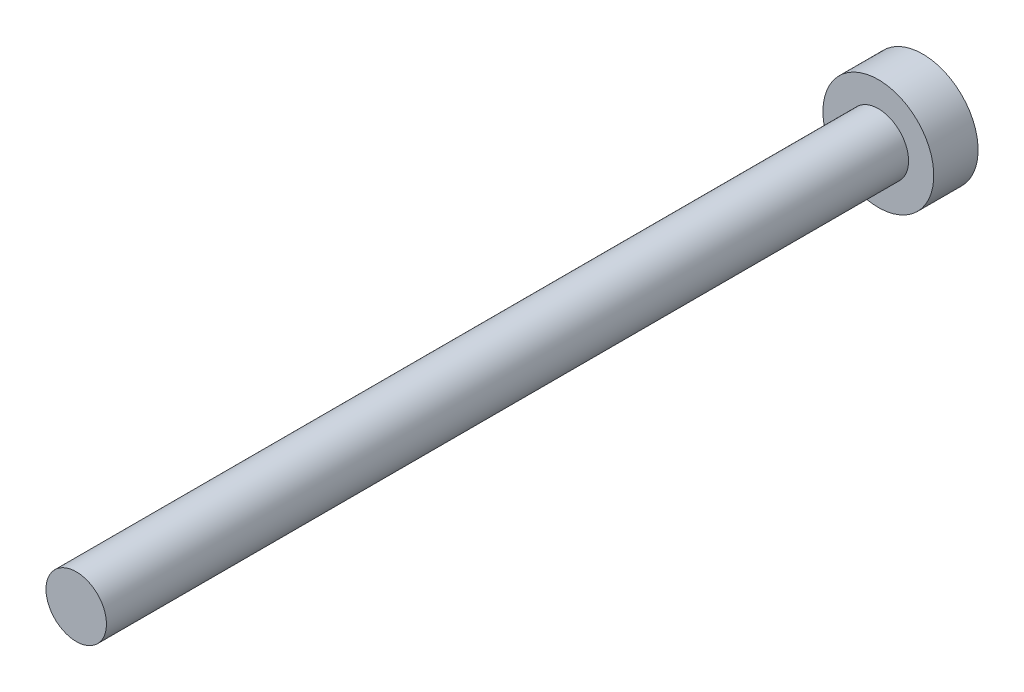
ISO-10303-21;
HEADER;
FILE_DESCRIPTION(('STEP AP214'),'2;1');
FILE_NAME('part.step','',(''),(''),'','','');
FILE_SCHEMA(('AUTOMOTIVE_DESIGN { 1 0 10303 214 1 1 1 1 }'));
ENDSEC;
DATA;
#1=APPLICATION_CONTEXT('core data for automotive mechanical design processes');
#2=APPLICATION_PROTOCOL_DEFINITION('international standard','automotive_design',2000,#1);
#3=PRODUCT_CONTEXT('',#1,'mechanical');
#4=PRODUCT('Part','Part','',(#3));
#5=PRODUCT_RELATED_PRODUCT_CATEGORY('part','',(#4));
#6=PRODUCT_DEFINITION_FORMATION('','',#4);
#7=PRODUCT_DEFINITION_CONTEXT('part definition',#1,'design');
#8=PRODUCT_DEFINITION('design','',#6,#7);
#9=PRODUCT_DEFINITION_SHAPE('','',#8);
#10=(LENGTH_UNIT() NAMED_UNIT(*) SI_UNIT(.MILLI.,.METRE.));
#11=(NAMED_UNIT(*) PLANE_ANGLE_UNIT() SI_UNIT($,.RADIAN.));
#12=(NAMED_UNIT(*) SI_UNIT($,.STERADIAN.) SOLID_ANGLE_UNIT());
#13=UNCERTAINTY_MEASURE_WITH_UNIT(LENGTH_MEASURE(1.E-05),#10,'distance_accuracy_value','');
#14=(GEOMETRIC_REPRESENTATION_CONTEXT(3) GLOBAL_UNCERTAINTY_ASSIGNED_CONTEXT((#13)) GLOBAL_UNIT_ASSIGNED_CONTEXT((#10,
#11,#12)) REPRESENTATION_CONTEXT('',''));
#15=CARTESIAN_POINT('',(0.,0.,0.));
#16=DIRECTION('',(0.,0.,1.));
#17=DIRECTION('',(1.,0.,0.));
#18=AXIS2_PLACEMENT_3D('',#15,#16,#17);
#19=CARTESIAN_POINT('',(0.,0.,42.));
#20=DIRECTION('',(0.,0.,-1.));
#21=DIRECTION('',(-1.,0.,0.));
#22=AXIS2_PLACEMENT_3D('',#19,#20,#21);
#23=CYLINDRICAL_SURFACE('',#22,1.5);
#24=CARTESIAN_POINT('',(0.,0.,42.));
#25=DIRECTION('',(0.,0.,1.));
#26=DIRECTION('',(1.,0.,0.));
#27=AXIS2_PLACEMENT_3D('',#24,#25,#26);
#28=CIRCLE('',#27,1.5);
#29=CARTESIAN_POINT('',(-1.5,0.,42.));
#30=VERTEX_POINT('',#29);
#31=EDGE_CURVE('E41',#30,#30,#28,.T.);
#32=CARTESIAN_POINT('',(0.,0.,2.2));
#33=DIRECTION('',(0.,0.,-1.));
#34=DIRECTION('',(-1.,0.,0.));
#35=AXIS2_PLACEMENT_3D('',#32,#33,#34);
#36=CIRCLE('',#35,1.5);
#37=CARTESIAN_POINT('',(-1.5,0.,2.20000000000001));
#38=VERTEX_POINT('',#37);
#39=EDGE_CURVE('E10',#38,#38,#36,.T.);
#40=CARTESIAN_POINT('',(-1.5,0.,42.));
#41=CARTESIAN_POINT('',(-1.5,0.,41.5854166666667));
#42=CARTESIAN_POINT('',(-1.5,0.,41.1708333333333));
#43=CARTESIAN_POINT('',(-1.5,0.,40.3416666666667));
#44=CARTESIAN_POINT('',(-1.5,0.,39.9270833333333));
#45=CARTESIAN_POINT('',(-1.5,0.,39.0979166666667));
#46=CARTESIAN_POINT('',(-1.5,0.,38.6833333333333));
#47=CARTESIAN_POINT('',(-1.5,0.,37.8541666666667));
#48=CARTESIAN_POINT('',(-1.5,0.,37.4395833333333));
#49=CARTESIAN_POINT('',(-1.5,0.,36.6104166666667));
#50=CARTESIAN_POINT('',(-1.5,0.,36.1958333333333));
#51=CARTESIAN_POINT('',(-1.5,0.,35.3666666666667));
#52=CARTESIAN_POINT('',(-1.5,0.,34.9520833333333));
#53=CARTESIAN_POINT('',(-1.5,0.,34.1229166666667));
#54=CARTESIAN_POINT('',(-1.5,0.,33.7083333333333));
#55=CARTESIAN_POINT('',(-1.5,0.,32.8791666666667));
#56=CARTESIAN_POINT('',(-1.5,0.,32.4645833333333));
#57=CARTESIAN_POINT('',(-1.5,0.,31.6354166666667));
#58=CARTESIAN_POINT('',(-1.5,0.,31.2208333333333));
#59=CARTESIAN_POINT('',(-1.5,0.,30.3916666666667));
#60=CARTESIAN_POINT('',(-1.5,0.,29.9770833333333));
#61=CARTESIAN_POINT('',(-1.5,0.,29.1479166666667));
#62=CARTESIAN_POINT('',(-1.5,0.,28.7333333333333));
#63=CARTESIAN_POINT('',(-1.5,0.,27.9041666666667));
#64=CARTESIAN_POINT('',(-1.5,0.,27.4895833333333));
#65=CARTESIAN_POINT('',(-1.5,0.,26.6604166666667));
#66=CARTESIAN_POINT('',(-1.5,0.,26.2458333333333));
#67=CARTESIAN_POINT('',(-1.5,0.,25.4166666666667));
#68=CARTESIAN_POINT('',(-1.5,0.,25.0020833333333));
#69=CARTESIAN_POINT('',(-1.5,0.,24.1729166666667));
#70=CARTESIAN_POINT('',(-1.5,0.,23.7583333333333));
#71=CARTESIAN_POINT('',(-1.5,0.,22.9291666666667));
#72=CARTESIAN_POINT('',(-1.5,0.,22.5145833333333));
#73=CARTESIAN_POINT('',(-1.5,0.,21.6854166666667));
#74=CARTESIAN_POINT('',(-1.5,0.,21.2708333333333));
#75=CARTESIAN_POINT('',(-1.5,0.,20.4416666666667));
#76=CARTESIAN_POINT('',(-1.5,0.,20.0270833333333));
#77=CARTESIAN_POINT('',(-1.5,0.,19.1979166666667));
#78=CARTESIAN_POINT('',(-1.5,0.,18.7833333333333));
#79=CARTESIAN_POINT('',(-1.5,0.,17.9541666666667));
#80=CARTESIAN_POINT('',(-1.5,0.,17.5395833333333));
#81=CARTESIAN_POINT('',(-1.5,0.,16.7104166666667));
#82=CARTESIAN_POINT('',(-1.5,0.,16.2958333333333));
#83=CARTESIAN_POINT('',(-1.5,0.,15.4666666666667));
#84=CARTESIAN_POINT('',(-1.5,0.,15.0520833333333));
#85=CARTESIAN_POINT('',(-1.5,0.,14.2229166666667));
#86=CARTESIAN_POINT('',(-1.5,0.,13.8083333333333));
#87=CARTESIAN_POINT('',(-1.5,0.,12.9791666666667));
#88=CARTESIAN_POINT('',(-1.5,0.,12.5645833333333));
#89=CARTESIAN_POINT('',(-1.5,0.,11.7354166666667));
#90=CARTESIAN_POINT('',(-1.5,0.,11.3208333333333));
#91=CARTESIAN_POINT('',(-1.5,0.,10.4916666666667));
#92=CARTESIAN_POINT('',(-1.5,0.,10.0770833333333));
#93=CARTESIAN_POINT('',(-1.5,0.,9.24791666666667));
#94=CARTESIAN_POINT('',(-1.5,0.,8.83333333333334));
#95=CARTESIAN_POINT('',(-1.5,0.,8.00416666666668));
#96=CARTESIAN_POINT('',(-1.5,0.,7.58958333333334));
#97=CARTESIAN_POINT('',(-1.5,0.,6.76041666666667));
#98=CARTESIAN_POINT('',(-1.5,0.,6.34583333333334));
#99=CARTESIAN_POINT('',(-1.5,0.,5.51666666666667));
#100=CARTESIAN_POINT('',(-1.5,0.,5.10208333333334));
#101=CARTESIAN_POINT('',(-1.5,0.,4.27291666666668));
#102=CARTESIAN_POINT('',(-1.5,0.,3.85833333333334));
#103=CARTESIAN_POINT('',(-1.5,0.,3.02916666666668));
#104=CARTESIAN_POINT('',(-1.5,0.,2.61458333333334));
#105=CARTESIAN_POINT('',(-1.5,0.,2.20000000000001));
#106=B_SPLINE_CURVE_WITH_KNOTS('',3,(#40,#41,#42,#43,#44,#45,#46,#47,#48,#49,#50,#51,#52,#53,
#54,#55,#56,#57,#58,#59,#60,#61,#62,#63,#64,#65,#66,#67,#68,#69,#70,#71,#72,#73,#74,#75,#76,#77,
#78,#79,#80,#81,#82,#83,#84,#85,#86,#87,#88,#89,#90,#91,#92,#93,#94,#95,#96,#97,#98,#99,#100,
#101,#102,#103,#104,#105),.UNSPECIFIED.,.F.,.F.,(4,2,2,2,2,2,2,2,2,2,2,2,2,2,2,2,2,2,2,2,2,2,2,
2,2,2,2,2,2,2,2,2,4),(0.,1.24375,2.4875,3.73125000000001,4.975,6.21875,7.4625,8.70625000000001,
9.95,11.19375,12.4375,13.68125,14.925,16.16875,17.4125,18.65625,19.9,21.14375,22.3875,23.63125,
24.875,26.11875,27.3625,28.60625,29.85,31.09375,32.3375,33.58125,34.825,36.06875,37.3125,
38.55625,39.8),.UNSPECIFIED.);
#107=EDGE_CURVE('BSEAM35',#30,#38,#106,.T.);
#108=ORIENTED_EDGE('',*,*,#31,.F.);
#109=ORIENTED_EDGE('',*,*,#39,.F.);
#110=ORIENTED_EDGE('',*,*,#107,.T.);
#111=ORIENTED_EDGE('',*,*,#107,.F.);
#112=EDGE_LOOP('',(#108,#110,#109,#111));
#113=FACE_BOUND('',#112,.T.);
#114=ADVANCED_FACE('F35',(#113),#23,.T.);
#115=CARTESIAN_POINT('',(0.,0.,42.));
#116=DIRECTION('',(0.,0.,1.));
#117=DIRECTION('',(1.,0.,0.));
#118=AXIS2_PLACEMENT_3D('',#115,#116,#117);
#119=PLANE('',#118);
#120=ORIENTED_EDGE('',*,*,#31,.T.);
#121=EDGE_LOOP('',(#120));
#122=FACE_BOUND('',#121,.T.);
#123=ADVANCED_FACE('F60',(#122),#119,.T.);
#124=CARTESIAN_POINT('',(0.,0.,2.2));
#125=DIRECTION('',(0.,0.,-1.));
#126=DIRECTION('',(-1.,0.,0.));
#127=AXIS2_PLACEMENT_3D('',#124,#125,#126);
#128=CYLINDRICAL_SURFACE('',#127,2.75);
#129=CARTESIAN_POINT('',(0.,0.,2.2));
#130=DIRECTION('',(0.,0.,-1.));
#131=DIRECTION('',(-1.,0.,0.));
#132=AXIS2_PLACEMENT_3D('',#129,#130,#131);
#133=CIRCLE('',#132,2.75);
#134=CARTESIAN_POINT('',(-2.75,0.,2.2));
#135=VERTEX_POINT('',#134);
#136=EDGE_CURVE('E45',#135,#135,#133,.T.);
#137=ORIENTED_EDGE('',*,*,#136,.T.);
#138=EDGE_LOOP('',(#137));
#139=FACE_BOUND('',#138,.T.);
#140=CARTESIAN_POINT('',(0.,0.,0.));
#141=DIRECTION('',(0.,0.,-1.));
#142=DIRECTION('',(-1.,0.,0.));
#143=AXIS2_PLACEMENT_3D('',#140,#141,#142);
#144=CIRCLE('',#143,2.75);
#145=CARTESIAN_POINT('',(-2.75,0.,0.));
#146=VERTEX_POINT('',#145);
#147=EDGE_CURVE('E49',#146,#146,#144,.T.);
#148=ORIENTED_EDGE('',*,*,#147,.F.);
#149=EDGE_LOOP('',(#148));
#150=FACE_BOUND('',#149,.T.);
#151=ADVANCED_FACE('F57',(#139,#150),#128,.T.);
#152=CARTESIAN_POINT('',(0.,0.,2.2));
#153=DIRECTION('',(0.,0.,-1.));
#154=DIRECTION('',(-1.,0.,0.));
#155=AXIS2_PLACEMENT_3D('',#152,#153,#154);
#156=PLANE('',#155);
#157=ORIENTED_EDGE('',*,*,#39,.T.);
#158=EDGE_LOOP('',(#157));
#159=FACE_BOUND('',#158,.T.);
#160=ORIENTED_EDGE('',*,*,#136,.F.);
#161=EDGE_LOOP('',(#160));
#162=FACE_BOUND('',#161,.T.);
#163=ADVANCED_FACE('F59',(#159,#162),#156,.F.);
#164=CARTESIAN_POINT('',(0.,0.,0.));
#165=DIRECTION('',(0.,0.,1.));
#166=DIRECTION('',(1.,0.,0.));
#167=AXIS2_PLACEMENT_3D('',#164,#165,#166);
#168=PLANE('',#167);
#169=ORIENTED_EDGE('',*,*,#147,.T.);
#170=EDGE_LOOP('',(#169));
#171=FACE_BOUND('',#170,.T.);
#172=ADVANCED_FACE('F55',(#171),#168,.F.);
#173=CLOSED_SHELL('',(#114,#123,#151,#163,#172));
#174=MANIFOLD_SOLID_BREP('B2',#173);
#175=ADVANCED_BREP_SHAPE_REPRESENTATION('',(#18,#174),#14);
#176=SHAPE_DEFINITION_REPRESENTATION(#9,#175);
ENDSEC;
END-ISO-10303-21;
